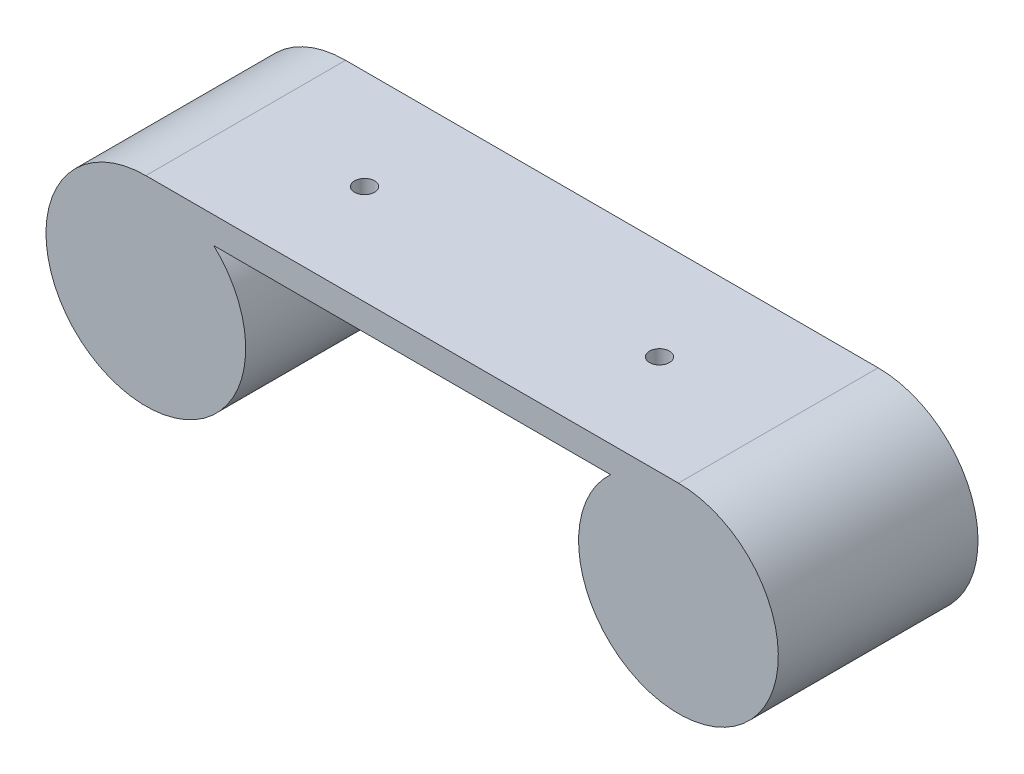
ISO-10303-21;
HEADER;
FILE_DESCRIPTION(('STEP AP214'),'2;1');
FILE_NAME('part.step','',(''),(''),'','','');
FILE_SCHEMA(('AUTOMOTIVE_DESIGN { 1 0 10303 214 1 1 1 1 }'));
ENDSEC;
DATA;
#1=APPLICATION_CONTEXT('core data for automotive mechanical design processes');
#2=APPLICATION_PROTOCOL_DEFINITION('international standard','automotive_design',2000,#1);
#3=PRODUCT_CONTEXT('',#1,'mechanical');
#4=PRODUCT('Part','Part','',(#3));
#5=PRODUCT_RELATED_PRODUCT_CATEGORY('part','',(#4));
#6=PRODUCT_DEFINITION_FORMATION('','',#4);
#7=PRODUCT_DEFINITION_CONTEXT('part definition',#1,'design');
#8=PRODUCT_DEFINITION('design','',#6,#7);
#9=PRODUCT_DEFINITION_SHAPE('','',#8);
#10=(LENGTH_UNIT() NAMED_UNIT(*) SI_UNIT(.MILLI.,.METRE.));
#11=(NAMED_UNIT(*) PLANE_ANGLE_UNIT() SI_UNIT($,.RADIAN.));
#12=(NAMED_UNIT(*) SI_UNIT($,.STERADIAN.) SOLID_ANGLE_UNIT());
#13=UNCERTAINTY_MEASURE_WITH_UNIT(LENGTH_MEASURE(1.E-05),#10,'distance_accuracy_value','');
#14=(GEOMETRIC_REPRESENTATION_CONTEXT(3) GLOBAL_UNCERTAINTY_ASSIGNED_CONTEXT((#13)) GLOBAL_UNIT_ASSIGNED_CONTEXT((#10,
#11,#12)) REPRESENTATION_CONTEXT('',''));
#15=CARTESIAN_POINT('',(0.,0.,0.));
#16=DIRECTION('',(0.,0.,1.));
#17=DIRECTION('',(1.,0.,0.));
#18=AXIS2_PLACEMENT_3D('',#15,#16,#17);
#19=CARTESIAN_POINT('',(40.,0.,30.));
#20=DIRECTION('',(0.,0.,-1.));
#21=DIRECTION('',(-1.,0.,0.));
#22=AXIS2_PLACEMENT_3D('',#19,#20,#21);
#23=CYLINDRICAL_SURFACE('',#22,5.);
#24=CARTESIAN_POINT('',(40.,0.,0.));
#25=DIRECTION('',(0.,0.,1.));
#26=DIRECTION('',(1.,0.,0.));
#27=AXIS2_PLACEMENT_3D('',#24,#25,#26);
#28=CIRCLE('',#27,5.);
#29=CARTESIAN_POINT('',(45.,0.,0.));
#30=VERTEX_POINT('',#29);
#31=EDGE_CURVE('E112',#30,#30,#28,.T.);
#32=ORIENTED_EDGE('',*,*,#31,.F.);
#33=EDGE_LOOP('',(#32));
#34=FACE_BOUND('',#33,.T.);
#35=CARTESIAN_POINT('',(40.,0.,28.));
#36=DIRECTION('',(0.,0.,1.));
#37=DIRECTION('',(1.,0.,0.));
#38=AXIS2_PLACEMENT_3D('',#35,#36,#37);
#39=CIRCLE('',#38,5.);
#40=CARTESIAN_POINT('',(45.,0.,28.));
#41=VERTEX_POINT('',#40);
#42=EDGE_CURVE('E44',#41,#41,#39,.T.);
#43=ORIENTED_EDGE('',*,*,#42,.T.);
#44=EDGE_LOOP('',(#43));
#45=FACE_BOUND('',#44,.T.);
#46=ADVANCED_FACE('F41',(#34,#45),#23,.F.);
#47=CARTESIAN_POINT('',(-40.,0.,30.));
#48=DIRECTION('',(0.,0.,-1.));
#49=DIRECTION('',(-1.,0.,0.));
#50=AXIS2_PLACEMENT_3D('',#47,#48,#49);
#51=CYLINDRICAL_SURFACE('',#50,5.);
#52=CARTESIAN_POINT('',(-40.,0.,0.));
#53=DIRECTION('',(0.,0.,1.));
#54=DIRECTION('',(1.,0.,0.));
#55=AXIS2_PLACEMENT_3D('',#52,#53,#54);
#56=CIRCLE('',#55,5.);
#57=CARTESIAN_POINT('',(-35.,0.,0.));
#58=VERTEX_POINT('',#57);
#59=EDGE_CURVE('E129',#58,#58,#56,.T.);
#60=ORIENTED_EDGE('',*,*,#59,.F.);
#61=EDGE_LOOP('',(#60));
#62=FACE_BOUND('',#61,.T.);
#63=CARTESIAN_POINT('',(-40.,0.,28.));
#64=DIRECTION('',(0.,0.,1.));
#65=DIRECTION('',(1.,0.,0.));
#66=AXIS2_PLACEMENT_3D('',#63,#64,#65);
#67=CIRCLE('',#66,5.);
#68=CARTESIAN_POINT('',(-35.,0.,28.));
#69=VERTEX_POINT('',#68);
#70=EDGE_CURVE('E136',#69,#69,#67,.T.);
#71=ORIENTED_EDGE('',*,*,#70,.T.);
#72=EDGE_LOOP('',(#71));
#73=FACE_BOUND('',#72,.T.);
#74=ADVANCED_FACE('F162',(#62,#73),#51,.F.);
#75=CARTESIAN_POINT('',(-40.,0.,30.));
#76=DIRECTION('',(0.,0.,-1.));
#77=DIRECTION('',(-1.,0.,0.));
#78=AXIS2_PLACEMENT_3D('',#75,#76,#77);
#79=CYLINDRICAL_SURFACE('',#78,15.);
#80=CARTESIAN_POINT('',(-40.,0.,0.));
#81=DIRECTION('',(0.,0.,1.));
#82=DIRECTION('',(1.,0.,0.));
#83=AXIS2_PLACEMENT_3D('',#80,#81,#82);
#84=CIRCLE('',#83,15.);
#85=CARTESIAN_POINT('',(-40.,15.,0.));
#86=VERTEX_POINT('',#85);
#87=CARTESIAN_POINT('',(-29.8023276035913,11.00033989,0.));
#88=VERTEX_POINT('',#87);
#89=EDGE_CURVE('E116',#86,#88,#84,.T.);
#90=ORIENTED_EDGE('',*,*,#89,.T.);
#91=DIRECTION('',(0.,0.,-1.));
#92=VECTOR('',#91,1.);
#93=CARTESIAN_POINT('',(-29.8023276035913,11.00033989,30.));
#94=LINE('',#93,#92);
#95=CARTESIAN_POINT('',(-29.8023276035913,11.00033989,30.));
#96=VERTEX_POINT('',#95);
#97=EDGE_CURVE('E11',#96,#88,#94,.T.);
#98=ORIENTED_EDGE('',*,*,#97,.F.);
#99=CARTESIAN_POINT('',(-40.,0.,30.));
#100=DIRECTION('',(0.,0.,1.));
#101=DIRECTION('',(1.,0.,0.));
#102=AXIS2_PLACEMENT_3D('',#99,#100,#101);
#103=CIRCLE('',#102,15.);
#104=CARTESIAN_POINT('',(-40.,15.,30.));
#105=VERTEX_POINT('',#104);
#106=EDGE_CURVE('E93',#105,#96,#103,.T.);
#107=ORIENTED_EDGE('',*,*,#106,.F.);
#108=DIRECTION('',(0.,0.,-1.));
#109=VECTOR('',#108,1.);
#110=CARTESIAN_POINT('',(-40.,15.,30.));
#111=LINE('',#110,#109);
#112=EDGE_CURVE('E60',#105,#86,#111,.T.);
#113=ORIENTED_EDGE('',*,*,#112,.T.);
#114=EDGE_LOOP('',(#90,#98,#107,#113));
#115=FACE_BOUND('',#114,.T.);
#116=ADVANCED_FACE('F167',(#115),#79,.T.);
#117=CARTESIAN_POINT('',(0.,11.00033989,30.));
#118=DIRECTION('',(0.,1.,0.));
#119=DIRECTION('',(-1.,0.,0.));
#120=AXIS2_PLACEMENT_3D('',#117,#118,#119);
#121=PLANE('',#120);
#122=CARTESIAN_POINT('',(-22.15,11.00033989,15.));
#123=DIRECTION('',(0.,1.,0.));
#124=DIRECTION('',(-1.,0.,0.));
#125=AXIS2_PLACEMENT_3D('',#122,#123,#124);
#126=CIRCLE('',#125,1.5);
#127=CARTESIAN_POINT('',(-23.65,11.00033989,15.));
#128=VERTEX_POINT('',#127);
#129=EDGE_CURVE('E117',#128,#128,#126,.T.);
#130=ORIENTED_EDGE('',*,*,#129,.T.);
#131=EDGE_LOOP('',(#130));
#132=FACE_BOUND('',#131,.T.);
#133=CARTESIAN_POINT('',(22.15,11.00033989,15.));
#134=DIRECTION('',(0.,1.,0.));
#135=DIRECTION('',(-1.,0.,0.));
#136=AXIS2_PLACEMENT_3D('',#133,#134,#135);
#137=CIRCLE('',#136,1.5);
#138=CARTESIAN_POINT('',(20.65,11.00033989,15.));
#139=VERTEX_POINT('',#138);
#140=EDGE_CURVE('E274',#139,#139,#137,.T.);
#141=ORIENTED_EDGE('',*,*,#140,.T.);
#142=EDGE_LOOP('',(#141));
#143=FACE_BOUND('',#142,.T.);
#144=DIRECTION('',(1.,0.,0.));
#145=VECTOR('',#144,1.);
#146=CARTESIAN_POINT('',(0.,11.00033989,0.));
#147=LINE('',#146,#145);
#148=CARTESIAN_POINT('',(29.8023276035913,11.00033989,0.));
#149=VERTEX_POINT('',#148);
#150=EDGE_CURVE('E99',#88,#149,#147,.T.);
#151=ORIENTED_EDGE('',*,*,#150,.T.);
#152=DIRECTION('',(0.,0.,-1.));
#153=VECTOR('',#152,1.);
#154=CARTESIAN_POINT('',(29.8023276035913,11.00033989,30.));
#155=LINE('',#154,#153);
#156=CARTESIAN_POINT('',(29.8023276035913,11.00033989,30.));
#157=VERTEX_POINT('',#156);
#158=EDGE_CURVE('E51',#157,#149,#155,.T.);
#159=ORIENTED_EDGE('',*,*,#158,.F.);
#160=DIRECTION('',(1.,0.,0.));
#161=VECTOR('',#160,1.);
#162=CARTESIAN_POINT('',(0.,11.00033989,30.));
#163=LINE('',#162,#161);
#164=EDGE_CURVE('E86',#96,#157,#163,.T.);
#165=ORIENTED_EDGE('',*,*,#164,.F.);
#166=ORIENTED_EDGE('',*,*,#97,.T.);
#167=EDGE_LOOP('',(#151,#159,#165,#166));
#168=FACE_BOUND('',#167,.T.);
#169=ADVANCED_FACE('F98',(#132,#143,#168),#121,.F.);
#170=CARTESIAN_POINT('',(40.,0.,30.));
#171=DIRECTION('',(0.,0.,-1.));
#172=DIRECTION('',(-1.,0.,0.));
#173=AXIS2_PLACEMENT_3D('',#170,#171,#172);
#174=CYLINDRICAL_SURFACE('',#173,15.);
#175=CARTESIAN_POINT('',(40.,0.,0.));
#176=DIRECTION('',(0.,0.,1.));
#177=DIRECTION('',(1.,0.,0.));
#178=AXIS2_PLACEMENT_3D('',#175,#176,#177);
#179=CIRCLE('',#178,15.);
#180=CARTESIAN_POINT('',(40.,15.,0.));
#181=VERTEX_POINT('',#180);
#182=EDGE_CURVE('E122',#149,#181,#179,.T.);
#183=ORIENTED_EDGE('',*,*,#182,.T.);
#184=DIRECTION('',(0.,0.,-1.));
#185=VECTOR('',#184,1.);
#186=CARTESIAN_POINT('',(40.,15.,30.));
#187=LINE('',#186,#185);
#188=CARTESIAN_POINT('',(40.,15.,30.));
#189=VERTEX_POINT('',#188);
#190=EDGE_CURVE('E75',#189,#181,#187,.T.);
#191=ORIENTED_EDGE('',*,*,#190,.F.);
#192=CARTESIAN_POINT('',(40.,0.,30.));
#193=DIRECTION('',(0.,0.,1.));
#194=DIRECTION('',(1.,0.,0.));
#195=AXIS2_PLACEMENT_3D('',#192,#193,#194);
#196=CIRCLE('',#195,15.);
#197=EDGE_CURVE('E92',#157,#189,#196,.T.);
#198=ORIENTED_EDGE('',*,*,#197,.F.);
#199=ORIENTED_EDGE('',*,*,#158,.T.);
#200=EDGE_LOOP('',(#183,#191,#198,#199));
#201=FACE_BOUND('',#200,.T.);
#202=ADVANCED_FACE('F104',(#201),#174,.T.);
#203=CARTESIAN_POINT('',(0.,15.,30.));
#204=DIRECTION('',(0.,1.,0.));
#205=DIRECTION('',(-1.,0.,0.));
#206=AXIS2_PLACEMENT_3D('',#203,#204,#205);
#207=PLANE('',#206);
#208=CARTESIAN_POINT('',(-22.15,15.,15.));
#209=DIRECTION('',(0.,1.,0.));
#210=DIRECTION('',(0.,0.,1.));
#211=AXIS2_PLACEMENT_3D('',#208,#209,#210);
#212=CIRCLE('',#211,1.5);
#213=CARTESIAN_POINT('',(-22.15,15.,16.5));
#214=VERTEX_POINT('',#213);
#215=EDGE_CURVE('E145',#214,#214,#212,.T.);
#216=ORIENTED_EDGE('',*,*,#215,.F.);
#217=EDGE_LOOP('',(#216));
#218=FACE_BOUND('',#217,.T.);
#219=CARTESIAN_POINT('',(22.15,15.,15.));
#220=DIRECTION('',(0.,1.,0.));
#221=DIRECTION('',(0.,0.,1.));
#222=AXIS2_PLACEMENT_3D('',#219,#220,#221);
#223=CIRCLE('',#222,1.5);
#224=CARTESIAN_POINT('',(22.15,15.,16.5));
#225=VERTEX_POINT('',#224);
#226=EDGE_CURVE('E139',#225,#225,#223,.T.);
#227=ORIENTED_EDGE('',*,*,#226,.F.);
#228=EDGE_LOOP('',(#227));
#229=FACE_BOUND('',#228,.T.);
#230=DIRECTION('',(1.,0.,0.));
#231=VECTOR('',#230,1.);
#232=CARTESIAN_POINT('',(0.,15.,0.));
#233=LINE('',#232,#231);
#234=EDGE_CURVE('E125',#86,#181,#233,.T.);
#235=ORIENTED_EDGE('',*,*,#234,.F.);
#236=ORIENTED_EDGE('',*,*,#112,.F.);
#237=DIRECTION('',(1.,0.,0.));
#238=VECTOR('',#237,1.);
#239=CARTESIAN_POINT('',(0.,15.,30.));
#240=LINE('',#239,#238);
#241=EDGE_CURVE('E106',#105,#189,#240,.T.);
#242=ORIENTED_EDGE('',*,*,#241,.T.);
#243=ORIENTED_EDGE('',*,*,#190,.T.);
#244=EDGE_LOOP('',(#235,#236,#242,#243));
#245=FACE_BOUND('',#244,.T.);
#246=ADVANCED_FACE('F179',(#218,#229,#245),#207,.T.);
#247=CARTESIAN_POINT('',(0.,0.,30.));
#248=DIRECTION('',(0.,0.,1.));
#249=DIRECTION('',(1.,0.,0.));
#250=AXIS2_PLACEMENT_3D('',#247,#248,#249);
#251=PLANE('',#250);
#252=ORIENTED_EDGE('',*,*,#106,.T.);
#253=ORIENTED_EDGE('',*,*,#164,.T.);
#254=ORIENTED_EDGE('',*,*,#197,.T.);
#255=ORIENTED_EDGE('',*,*,#241,.F.);
#256=EDGE_LOOP('',(#252,#253,#254,#255));
#257=FACE_BOUND('',#256,.T.);
#258=ADVANCED_FACE('F89',(#257),#251,.T.);
#259=CARTESIAN_POINT('',(0.,0.,0.));
#260=DIRECTION('',(0.,0.,1.));
#261=DIRECTION('',(1.,0.,0.));
#262=AXIS2_PLACEMENT_3D('',#259,#260,#261);
#263=PLANE('',#262);
#264=ORIENTED_EDGE('',*,*,#31,.T.);
#265=EDGE_LOOP('',(#264));
#266=FACE_BOUND('',#265,.T.);
#267=ORIENTED_EDGE('',*,*,#89,.F.);
#268=ORIENTED_EDGE('',*,*,#234,.T.);
#269=ORIENTED_EDGE('',*,*,#182,.F.);
#270=ORIENTED_EDGE('',*,*,#150,.F.);
#271=EDGE_LOOP('',(#267,#268,#269,#270));
#272=FACE_BOUND('',#271,.T.);
#273=ORIENTED_EDGE('',*,*,#59,.T.);
#274=EDGE_LOOP('',(#273));
#275=FACE_BOUND('',#274,.T.);
#276=ADVANCED_FACE('F172',(#266,#272,#275),#263,.F.);
#277=CARTESIAN_POINT('',(22.15,9.00000000000002,15.));
#278=DIRECTION('',(0.,1.,0.));
#279=DIRECTION('',(0.,0.,1.));
#280=AXIS2_PLACEMENT_3D('',#277,#278,#279);
#281=CYLINDRICAL_SURFACE('',#280,1.5);
#282=ORIENTED_EDGE('',*,*,#226,.T.);
#283=EDGE_LOOP('',(#282));
#284=FACE_BOUND('',#283,.T.);
#285=ORIENTED_EDGE('',*,*,#140,.F.);
#286=EDGE_LOOP('',(#285));
#287=FACE_BOUND('',#286,.T.);
#288=ADVANCED_FACE('F175',(#284,#287),#281,.F.);
#289=CARTESIAN_POINT('',(-22.15,9.00000000000002,15.));
#290=DIRECTION('',(0.,1.,0.));
#291=DIRECTION('',(0.,0.,1.));
#292=AXIS2_PLACEMENT_3D('',#289,#290,#291);
#293=CYLINDRICAL_SURFACE('',#292,1.5);
#294=ORIENTED_EDGE('',*,*,#215,.T.);
#295=EDGE_LOOP('',(#294));
#296=FACE_BOUND('',#295,.T.);
#297=ORIENTED_EDGE('',*,*,#129,.F.);
#298=EDGE_LOOP('',(#297));
#299=FACE_BOUND('',#298,.T.);
#300=ADVANCED_FACE('F158',(#296,#299),#293,.F.);
#301=CARTESIAN_POINT('',(-40.,0.,28.));
#302=DIRECTION('',(0.,0.,1.));
#303=DIRECTION('',(1.,0.,0.));
#304=AXIS2_PLACEMENT_3D('',#301,#302,#303);
#305=PLANE('',#304);
#306=ORIENTED_EDGE('',*,*,#70,.F.);
#307=EDGE_LOOP('',(#306));
#308=FACE_BOUND('',#307,.T.);
#309=ADVANCED_FACE('F153',(#308),#305,.F.);
#310=CARTESIAN_POINT('',(40.,0.,28.));
#311=DIRECTION('',(0.,0.,1.));
#312=DIRECTION('',(1.,0.,0.));
#313=AXIS2_PLACEMENT_3D('',#310,#311,#312);
#314=PLANE('',#313);
#315=ORIENTED_EDGE('',*,*,#42,.F.);
#316=EDGE_LOOP('',(#315));
#317=FACE_BOUND('',#316,.T.);
#318=ADVANCED_FACE('F151',(#317),#314,.F.);
#319=CLOSED_SHELL('',(#46,#74,#116,#169,#202,#246,#258,#276,#288,#300,#309,#318));
#320=MANIFOLD_SOLID_BREP('B2',#319);
#321=ADVANCED_BREP_SHAPE_REPRESENTATION('',(#18,#320),#14);
#322=SHAPE_DEFINITION_REPRESENTATION(#9,#321);
ENDSEC;
END-ISO-10303-21;
